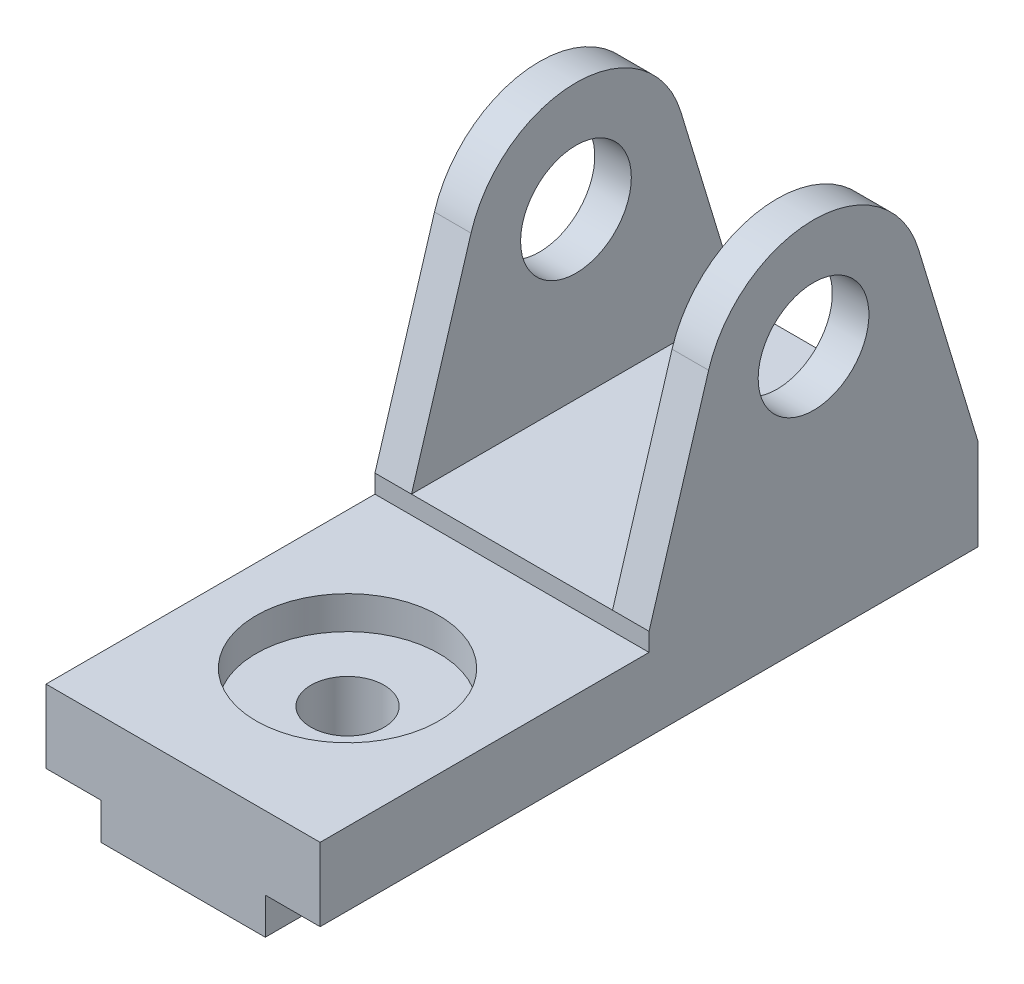
ISO-10303-21;
HEADER;
FILE_DESCRIPTION(('STEP AP214'),'2;1');
FILE_NAME('part.step','',(''),(''),'','','');
FILE_SCHEMA(('AUTOMOTIVE_DESIGN { 1 0 10303 214 1 1 1 1 }'));
ENDSEC;
DATA;
#1=APPLICATION_CONTEXT('core data for automotive mechanical design processes');
#2=APPLICATION_PROTOCOL_DEFINITION('international standard','automotive_design',2000,#1);
#3=PRODUCT_CONTEXT('',#1,'mechanical');
#4=PRODUCT('Part','Part','',(#3));
#5=PRODUCT_RELATED_PRODUCT_CATEGORY('part','',(#4));
#6=PRODUCT_DEFINITION_FORMATION('','',#4);
#7=PRODUCT_DEFINITION_CONTEXT('part definition',#1,'design');
#8=PRODUCT_DEFINITION('design','',#6,#7);
#9=PRODUCT_DEFINITION_SHAPE('','',#8);
#10=(LENGTH_UNIT() NAMED_UNIT(*) SI_UNIT(.MILLI.,.METRE.));
#11=(NAMED_UNIT(*) PLANE_ANGLE_UNIT() SI_UNIT($,.RADIAN.));
#12=(NAMED_UNIT(*) SI_UNIT($,.STERADIAN.) SOLID_ANGLE_UNIT());
#13=UNCERTAINTY_MEASURE_WITH_UNIT(LENGTH_MEASURE(1.E-05),#10,'distance_accuracy_value','');
#14=(GEOMETRIC_REPRESENTATION_CONTEXT(3) GLOBAL_UNCERTAINTY_ASSIGNED_CONTEXT((#13)) GLOBAL_UNIT_ASSIGNED_CONTEXT((#10,
#11,#12)) REPRESENTATION_CONTEXT('',''));
#15=CARTESIAN_POINT('',(0.,0.,0.));
#16=DIRECTION('',(0.,0.,1.));
#17=DIRECTION('',(1.,0.,0.));
#18=AXIS2_PLACEMENT_3D('',#15,#16,#17);
#19=CARTESIAN_POINT('',(157.915945787923,35.,0.));
#20=DIRECTION('',(0.,0.29027623112899,0.956942897795657));
#21=DIRECTION('',(0.,-0.956942897795657,0.29027623112899));
#22=AXIS2_PLACEMENT_3D('',#19,#20,#21);
#23=PLANE('',#22);
#24=DIRECTION('',(-1.,0.,0.));
#25=VECTOR('',#24,1.);
#26=CARTESIAN_POINT('',(157.915945787923,35.,0.));
#27=LINE('',#26,#25);
#28=CARTESIAN_POINT('',(-27.5,35.,0.));
#29=VERTEX_POINT('',#28);
#30=CARTESIAN_POINT('',(-37.5,35.,0.));
#31=VERTEX_POINT('',#30);
#32=EDGE_CURVE('E185',#29,#31,#27,.T.);
#33=ORIENTED_EDGE('',*,*,#32,.F.);
#34=DIRECTION('',(0.,0.956942897795657,-0.29027623112899));
#35=VECTOR('',#34,1.);
#36=CARTESIAN_POINT('',(-27.5,35.,0.));
#37=LINE('',#36,#35);
#38=CARTESIAN_POINT('',(-27.5,88.7082869338697,-16.2917130661303));
#39=VERTEX_POINT('',#38);
#40=EDGE_CURVE('E162',#29,#39,#37,.T.);
#41=ORIENTED_EDGE('',*,*,#40,.T.);
#42=DIRECTION('',(-1.,0.,0.));
#43=VECTOR('',#42,1.);
#44=CARTESIAN_POINT('',(157.915945787923,88.7082869338697,-16.2917130661303));
#45=LINE('',#44,#43);
#46=CARTESIAN_POINT('',(-37.5,88.7082869338697,-16.2917130661303));
#47=VERTEX_POINT('',#46);
#48=EDGE_CURVE('E263',#39,#47,#45,.T.);
#49=ORIENTED_EDGE('',*,*,#48,.T.);
#50=DIRECTION('',(0.,0.956942897795657,-0.29027623112899));
#51=VECTOR('',#50,1.);
#52=CARTESIAN_POINT('',(-37.5,35.,0.));
#53=LINE('',#52,#51);
#54=EDGE_CURVE('E187',#31,#47,#53,.T.);
#55=ORIENTED_EDGE('',*,*,#54,.F.);
#56=EDGE_LOOP('',(#33,#41,#49,#55));
#57=FACE_BOUND('',#56,.T.);
#58=ADVANCED_FACE('F45',(#57),#23,.T.);
#59=CARTESIAN_POINT('',(37.5,88.7082869338697,-16.2917130661303));
#60=VERTEX_POINT('',#59);
#61=CARTESIAN_POINT('',(27.5,88.7082869338697,-16.2917130661303));
#62=VERTEX_POINT('',#61);
#63=EDGE_CURVE('E260',#60,#62,#45,.T.);
#64=ORIENTED_EDGE('',*,*,#63,.T.);
#65=DIRECTION('',(0.,-0.956942897795657,0.29027623112899));
#66=VECTOR('',#65,1.);
#67=CARTESIAN_POINT('',(27.5,35.,0.));
#68=LINE('',#67,#66);
#69=CARTESIAN_POINT('',(27.5,35.,0.));
#70=VERTEX_POINT('',#69);
#71=EDGE_CURVE('E213',#62,#70,#68,.T.);
#72=ORIENTED_EDGE('',*,*,#71,.T.);
#73=CARTESIAN_POINT('',(37.5,35.,0.));
#74=VERTEX_POINT('',#73);
#75=EDGE_CURVE('E189',#74,#70,#27,.T.);
#76=ORIENTED_EDGE('',*,*,#75,.F.);
#77=DIRECTION('',(0.,-0.956942897795657,0.29027623112899));
#78=VECTOR('',#77,1.);
#79=CARTESIAN_POINT('',(37.5,35.,0.));
#80=LINE('',#79,#78);
#81=EDGE_CURVE('E227',#60,#74,#80,.T.);
#82=ORIENTED_EDGE('',*,*,#81,.F.);
#83=EDGE_LOOP('',(#64,#72,#76,#82));
#84=FACE_BOUND('',#83,.T.);
#85=ADVANCED_FACE('F371',(#84),#23,.T.);
#86=CARTESIAN_POINT('',(157.915945787923,80.,-45.));
#87=DIRECTION('',(-1.,0.,0.));
#88=DIRECTION('',(0.,0.,1.));
#89=AXIS2_PLACEMENT_3D('',#86,#87,#88);
#90=CYLINDRICAL_SURFACE('',#89,30.);
#91=CARTESIAN_POINT('',(-27.5,80.,-45.));
#92=DIRECTION('',(1.,0.,0.));
#93=DIRECTION('',(0.,0.,-1.));
#94=AXIS2_PLACEMENT_3D('',#91,#92,#93);
#95=CIRCLE('',#94,30.);
#96=CARTESIAN_POINT('',(-27.5,88.7082869338697,-73.7082869338697));
#97=VERTEX_POINT('',#96);
#98=EDGE_CURVE('E169',#39,#97,#95,.F.);
#99=ORIENTED_EDGE('',*,*,#98,.T.);
#100=DIRECTION('',(-1.,0.,0.));
#101=VECTOR('',#100,1.);
#102=CARTESIAN_POINT('',(157.915945787923,88.7082869338697,-73.7082869338697));
#103=LINE('',#102,#101);
#104=CARTESIAN_POINT('',(-37.5,88.7082869338697,-73.7082869338697));
#105=VERTEX_POINT('',#104);
#106=EDGE_CURVE('E259',#97,#105,#103,.T.);
#107=ORIENTED_EDGE('',*,*,#106,.T.);
#108=CARTESIAN_POINT('',(-37.5,80.,-45.));
#109=DIRECTION('',(-1.,0.,0.));
#110=DIRECTION('',(0.,0.,1.));
#111=AXIS2_PLACEMENT_3D('',#108,#109,#110);
#112=CIRCLE('',#111,30.);
#113=EDGE_CURVE('E243',#47,#105,#112,.T.);
#114=ORIENTED_EDGE('',*,*,#113,.F.);
#115=ORIENTED_EDGE('',*,*,#48,.F.);
#116=EDGE_LOOP('',(#99,#107,#114,#115));
#117=FACE_BOUND('',#116,.T.);
#118=ADVANCED_FACE('F377',(#117),#90,.T.);
#119=CARTESIAN_POINT('',(37.5,88.7082869338697,-73.7082869338697));
#120=VERTEX_POINT('',#119);
#121=CARTESIAN_POINT('',(27.5,88.7082869338697,-73.7082869338697));
#122=VERTEX_POINT('',#121);
#123=EDGE_CURVE('E255',#120,#122,#103,.T.);
#124=ORIENTED_EDGE('',*,*,#123,.T.);
#125=CARTESIAN_POINT('',(27.5,80.,-45.));
#126=DIRECTION('',(-1.,0.,0.));
#127=DIRECTION('',(0.,0.,1.));
#128=AXIS2_PLACEMENT_3D('',#125,#126,#127);
#129=CIRCLE('',#128,30.);
#130=EDGE_CURVE('E209',#122,#62,#129,.F.);
#131=ORIENTED_EDGE('',*,*,#130,.T.);
#132=ORIENTED_EDGE('',*,*,#63,.F.);
#133=CARTESIAN_POINT('',(37.5,80.,-45.));
#134=DIRECTION('',(-1.,0.,0.));
#135=DIRECTION('',(0.,0.,1.));
#136=AXIS2_PLACEMENT_3D('',#133,#134,#135);
#137=CIRCLE('',#136,30.);
#138=EDGE_CURVE('E230',#120,#60,#137,.F.);
#139=ORIENTED_EDGE('',*,*,#138,.F.);
#140=EDGE_LOOP('',(#124,#131,#132,#139));
#141=FACE_BOUND('',#140,.T.);
#142=ADVANCED_FACE('F494',(#141),#90,.T.);
#143=CARTESIAN_POINT('',(157.915945787923,35.,-90.));
#144=DIRECTION('',(0.,0.29027623112899,-0.956942897795657));
#145=DIRECTION('',(0.,0.956942897795657,0.29027623112899));
#146=AXIS2_PLACEMENT_3D('',#143,#144,#145);
#147=PLANE('',#146);
#148=ORIENTED_EDGE('',*,*,#106,.F.);
#149=DIRECTION('',(0.,-0.956942897795657,-0.29027623112899));
#150=VECTOR('',#149,1.);
#151=CARTESIAN_POINT('',(-27.5,35.,-90.));
#152=LINE('',#151,#150);
#153=CARTESIAN_POINT('',(-27.5,35.,-90.));
#154=VERTEX_POINT('',#153);
#155=EDGE_CURVE('E217',#97,#154,#152,.T.);
#156=ORIENTED_EDGE('',*,*,#155,.T.);
#157=DIRECTION('',(-1.,0.,0.));
#158=VECTOR('',#157,1.);
#159=CARTESIAN_POINT('',(157.915945787923,35.,-90.));
#160=LINE('',#159,#158);
#161=CARTESIAN_POINT('',(-37.5,35.,-90.));
#162=VERTEX_POINT('',#161);
#163=EDGE_CURVE('E254',#154,#162,#160,.T.);
#164=ORIENTED_EDGE('',*,*,#163,.T.);
#165=DIRECTION('',(0.,-0.956942897795657,-0.29027623112899));
#166=VECTOR('',#165,1.);
#167=CARTESIAN_POINT('',(-37.5,35.,-90.));
#168=LINE('',#167,#166);
#169=EDGE_CURVE('E247',#105,#162,#168,.T.);
#170=ORIENTED_EDGE('',*,*,#169,.F.);
#171=EDGE_LOOP('',(#148,#156,#164,#170));
#172=FACE_BOUND('',#171,.T.);
#173=ADVANCED_FACE('F500',(#172),#147,.T.);
#174=CARTESIAN_POINT('',(37.5,35.,-90.));
#175=VERTEX_POINT('',#174);
#176=CARTESIAN_POINT('',(27.5,35.,-90.));
#177=VERTEX_POINT('',#176);
#178=EDGE_CURVE('E231',#175,#177,#160,.T.);
#179=ORIENTED_EDGE('',*,*,#178,.T.);
#180=DIRECTION('',(0.,0.956942897795657,0.29027623112899));
#181=VECTOR('',#180,1.);
#182=CARTESIAN_POINT('',(27.5,35.,-90.));
#183=LINE('',#182,#181);
#184=EDGE_CURVE('E205',#177,#122,#183,.T.);
#185=ORIENTED_EDGE('',*,*,#184,.T.);
#186=ORIENTED_EDGE('',*,*,#123,.F.);
#187=DIRECTION('',(0.,0.956942897795657,0.29027623112899));
#188=VECTOR('',#187,1.);
#189=CARTESIAN_POINT('',(37.5,35.,-90.));
#190=LINE('',#189,#188);
#191=EDGE_CURVE('E226',#175,#120,#190,.T.);
#192=ORIENTED_EDGE('',*,*,#191,.F.);
#193=EDGE_LOOP('',(#179,#185,#186,#192));
#194=FACE_BOUND('',#193,.T.);
#195=ADVANCED_FACE('F366',(#194),#147,.T.);
#196=CARTESIAN_POINT('',(157.915945787923,80.,-45.));
#197=DIRECTION('',(-1.,0.,0.));
#198=DIRECTION('',(0.,0.,1.));
#199=AXIS2_PLACEMENT_3D('',#196,#197,#198);
#200=CYLINDRICAL_SURFACE('',#199,15.1496212561406);
#201=CARTESIAN_POINT('',(-37.5,80.,-45.));
#202=DIRECTION('',(-1.,0.,0.));
#203=DIRECTION('',(0.,0.,1.));
#204=AXIS2_PLACEMENT_3D('',#201,#202,#203);
#205=CIRCLE('',#204,15.1496212561406);
#206=CARTESIAN_POINT('',(-37.5,80.,-29.8503787438595));
#207=VERTEX_POINT('',#206);
#208=EDGE_CURVE('E174',#207,#207,#205,.T.);
#209=ORIENTED_EDGE('',*,*,#208,.T.);
#210=EDGE_LOOP('',(#209));
#211=FACE_BOUND('',#210,.T.);
#212=CARTESIAN_POINT('',(-27.5,80.,-45.));
#213=DIRECTION('',(1.,0.,0.));
#214=DIRECTION('',(0.,0.,-1.));
#215=AXIS2_PLACEMENT_3D('',#212,#213,#214);
#216=CIRCLE('',#215,15.1496212561406);
#217=CARTESIAN_POINT('',(-27.5,80.,-60.1496212561406));
#218=VERTEX_POINT('',#217);
#219=EDGE_CURVE('E49',#218,#218,#216,.F.);
#220=ORIENTED_EDGE('',*,*,#219,.F.);
#221=EDGE_LOOP('',(#220));
#222=FACE_BOUND('',#221,.T.);
#223=ADVANCED_FACE('F356',(#211,#222),#200,.F.);
#224=CARTESIAN_POINT('',(37.5,80.,-45.));
#225=DIRECTION('',(-1.,0.,0.));
#226=DIRECTION('',(0.,0.,1.));
#227=AXIS2_PLACEMENT_3D('',#224,#225,#226);
#228=CIRCLE('',#227,15.1496212561406);
#229=CARTESIAN_POINT('',(37.5,80.,-29.8503787438595));
#230=VERTEX_POINT('',#229);
#231=EDGE_CURVE('E225',#230,#230,#228,.F.);
#232=ORIENTED_EDGE('',*,*,#231,.T.);
#233=EDGE_LOOP('',(#232));
#234=FACE_BOUND('',#233,.T.);
#235=CARTESIAN_POINT('',(27.5,80.,-45.));
#236=DIRECTION('',(-1.,0.,0.));
#237=DIRECTION('',(0.,0.,1.));
#238=AXIS2_PLACEMENT_3D('',#235,#236,#237);
#239=CIRCLE('',#238,15.1496212561406);
#240=CARTESIAN_POINT('',(27.5,80.,-29.8503787438595));
#241=VERTEX_POINT('',#240);
#242=EDGE_CURVE('E204',#241,#241,#239,.F.);
#243=ORIENTED_EDGE('',*,*,#242,.F.);
#244=EDGE_LOOP('',(#243));
#245=FACE_BOUND('',#244,.T.);
#246=ADVANCED_FACE('F353',(#234,#245),#200,.F.);
#247=CARTESIAN_POINT('',(0.,30.,0.));
#248=DIRECTION('',(0.,1.,0.));
#249=DIRECTION('',(0.,0.,1.));
#250=AXIS2_PLACEMENT_3D('',#247,#248,#249);
#251=PLANE('',#250);
#252=CARTESIAN_POINT('',(0.,30.,45.));
#253=DIRECTION('',(0.,1.,0.));
#254=DIRECTION('',(0.,0.,1.));
#255=AXIS2_PLACEMENT_3D('',#252,#253,#254);
#256=CIRCLE('',#255,25.);
#257=CARTESIAN_POINT('',(0.,30.,70.));
#258=VERTEX_POINT('',#257);
#259=EDGE_CURVE('E470',#258,#258,#256,.T.);
#260=ORIENTED_EDGE('',*,*,#259,.F.);
#261=EDGE_LOOP('',(#260));
#262=FACE_BOUND('',#261,.T.);
#263=DIRECTION('',(0.,0.,-1.));
#264=VECTOR('',#263,1.);
#265=CARTESIAN_POINT('',(37.5,30.,-90.));
#266=LINE('',#265,#264);
#267=CARTESIAN_POINT('',(37.5,30.,90.));
#268=VERTEX_POINT('',#267);
#269=CARTESIAN_POINT('',(37.5,30.,0.));
#270=VERTEX_POINT('',#269);
#271=EDGE_CURVE('E321',#268,#270,#266,.T.);
#272=ORIENTED_EDGE('',*,*,#271,.T.);
#273=DIRECTION('',(-1.,0.,0.));
#274=VECTOR('',#273,1.);
#275=CARTESIAN_POINT('',(157.915945787923,30.,0.));
#276=LINE('',#275,#274);
#277=CARTESIAN_POINT('',(-37.5,30.,0.));
#278=VERTEX_POINT('',#277);
#279=EDGE_CURVE('E190',#270,#278,#276,.T.);
#280=ORIENTED_EDGE('',*,*,#279,.T.);
#281=DIRECTION('',(0.,0.,1.));
#282=VECTOR('',#281,1.);
#283=CARTESIAN_POINT('',(-37.5,30.,-90.));
#284=LINE('',#283,#282);
#285=CARTESIAN_POINT('',(-37.5,30.,90.));
#286=VERTEX_POINT('',#285);
#287=EDGE_CURVE('E325',#278,#286,#284,.T.);
#288=ORIENTED_EDGE('',*,*,#287,.T.);
#289=DIRECTION('',(1.,0.,0.));
#290=VECTOR('',#289,1.);
#291=CARTESIAN_POINT('',(-37.5,30.,90.));
#292=LINE('',#291,#290);
#293=EDGE_CURVE('E329',#286,#268,#292,.T.);
#294=ORIENTED_EDGE('',*,*,#293,.T.);
#295=EDGE_LOOP('',(#272,#280,#288,#294));
#296=FACE_BOUND('',#295,.T.);
#297=ADVANCED_FACE('F355',(#262,#296),#251,.T.);
#298=CARTESIAN_POINT('',(37.5,30.,-90.));
#299=DIRECTION('',(-1.,0.,0.));
#300=DIRECTION('',(0.,0.,1.));
#301=AXIS2_PLACEMENT_3D('',#298,#299,#300);
#302=PLANE('',#301);
#303=DIRECTION('',(0.,0.,1.));
#304=VECTOR('',#303,1.);
#305=CARTESIAN_POINT('',(37.5,9.99999999999999,-90.));
#306=LINE('',#305,#304);
#307=CARTESIAN_POINT('',(37.5,9.99999999999999,-90.));
#308=VERTEX_POINT('',#307);
#309=CARTESIAN_POINT('',(37.5,9.99999999999999,90.));
#310=VERTEX_POINT('',#309);
#311=EDGE_CURVE('E279',#308,#310,#306,.T.);
#312=ORIENTED_EDGE('',*,*,#311,.F.);
#313=DIRECTION('',(0.,-1.,0.));
#314=VECTOR('',#313,1.);
#315=CARTESIAN_POINT('',(37.5,30.,-90.));
#316=LINE('',#315,#314);
#317=EDGE_CURVE('E11',#175,#308,#316,.T.);
#318=ORIENTED_EDGE('',*,*,#317,.F.);
#319=ORIENTED_EDGE('',*,*,#191,.T.);
#320=ORIENTED_EDGE('',*,*,#138,.T.);
#321=ORIENTED_EDGE('',*,*,#81,.T.);
#322=DIRECTION('',(0.,-1.,0.));
#323=VECTOR('',#322,1.);
#324=CARTESIAN_POINT('',(37.5,30.,0.));
#325=LINE('',#324,#323);
#326=EDGE_CURVE('E222',#74,#270,#325,.T.);
#327=ORIENTED_EDGE('',*,*,#326,.T.);
#328=ORIENTED_EDGE('',*,*,#271,.F.);
#329=DIRECTION('',(0.,-1.,0.));
#330=VECTOR('',#329,1.);
#331=CARTESIAN_POINT('',(37.5,30.,90.));
#332=LINE('',#331,#330);
#333=EDGE_CURVE('E332',#268,#310,#332,.T.);
#334=ORIENTED_EDGE('',*,*,#333,.T.);
#335=EDGE_LOOP('',(#312,#318,#319,#320,#321,#327,#328,#334));
#336=FACE_BOUND('',#335,.T.);
#337=ORIENTED_EDGE('',*,*,#231,.F.);
#338=EDGE_LOOP('',(#337));
#339=FACE_BOUND('',#338,.T.);
#340=ADVANCED_FACE('F47',(#336,#339),#302,.F.);
#341=CARTESIAN_POINT('',(-37.5,30.,-90.));
#342=DIRECTION('',(0.,0.,1.));
#343=DIRECTION('',(1.,0.,0.));
#344=AXIS2_PLACEMENT_3D('',#341,#342,#343);
#345=PLANE('',#344);
#346=DIRECTION('',(0.,1.,0.));
#347=VECTOR('',#346,1.);
#348=CARTESIAN_POINT('',(22.5,0.,-90.));
#349=LINE('',#348,#347);
#350=CARTESIAN_POINT('',(22.5,0.,-90.));
#351=VERTEX_POINT('',#350);
#352=CARTESIAN_POINT('',(22.5,10.,-90.));
#353=VERTEX_POINT('',#352);
#354=EDGE_CURVE('E275',#351,#353,#349,.T.);
#355=ORIENTED_EDGE('',*,*,#354,.F.);
#356=DIRECTION('',(-1.,0.,0.));
#357=VECTOR('',#356,1.);
#358=CARTESIAN_POINT('',(-37.5,0.,-90.));
#359=LINE('',#358,#357);
#360=CARTESIAN_POINT('',(-22.5,0.,-90.));
#361=VERTEX_POINT('',#360);
#362=EDGE_CURVE('E315',#351,#361,#359,.T.);
#363=ORIENTED_EDGE('',*,*,#362,.T.);
#364=DIRECTION('',(0.,1.,0.));
#365=VECTOR('',#364,1.);
#366=CARTESIAN_POINT('',(-22.5,0.,-90.));
#367=LINE('',#366,#365);
#368=CARTESIAN_POINT('',(-22.5,10.,-90.));
#369=VERTEX_POINT('',#368);
#370=EDGE_CURVE('E296',#361,#369,#367,.T.);
#371=ORIENTED_EDGE('',*,*,#370,.T.);
#372=DIRECTION('',(-1.,0.,0.));
#373=VECTOR('',#372,1.);
#374=CARTESIAN_POINT('',(-22.5,10.,-90.));
#375=LINE('',#374,#373);
#376=CARTESIAN_POINT('',(-37.5,9.99999999999999,-90.));
#377=VERTEX_POINT('',#376);
#378=EDGE_CURVE('E300',#369,#377,#375,.T.);
#379=ORIENTED_EDGE('',*,*,#378,.T.);
#380=DIRECTION('',(0.,-1.,0.));
#381=VECTOR('',#380,1.);
#382=CARTESIAN_POINT('',(-37.5,30.,-90.));
#383=LINE('',#382,#381);
#384=EDGE_CURVE('E55',#162,#377,#383,.T.);
#385=ORIENTED_EDGE('',*,*,#384,.F.);
#386=ORIENTED_EDGE('',*,*,#163,.F.);
#387=DIRECTION('',(-1.,0.,0.));
#388=VECTOR('',#387,1.);
#389=CARTESIAN_POINT('',(-27.5,35.,-90.));
#390=LINE('',#389,#388);
#391=EDGE_CURVE('E180',#177,#154,#390,.T.);
#392=ORIENTED_EDGE('',*,*,#391,.F.);
#393=ORIENTED_EDGE('',*,*,#178,.F.);
#394=ORIENTED_EDGE('',*,*,#317,.T.);
#395=DIRECTION('',(1.,0.,0.));
#396=VECTOR('',#395,1.);
#397=CARTESIAN_POINT('',(22.5,10.,-90.));
#398=LINE('',#397,#396);
#399=EDGE_CURVE('E272',#353,#308,#398,.T.);
#400=ORIENTED_EDGE('',*,*,#399,.F.);
#401=EDGE_LOOP('',(#355,#363,#371,#379,#385,#386,#392,#393,#394,#400));
#402=FACE_BOUND('',#401,.T.);
#403=ADVANCED_FACE('F407',(#402),#345,.F.);
#404=CARTESIAN_POINT('',(-37.5,30.,90.));
#405=DIRECTION('',(0.,0.,-1.));
#406=DIRECTION('',(-1.,0.,0.));
#407=AXIS2_PLACEMENT_3D('',#404,#405,#406);
#408=PLANE('',#407);
#409=DIRECTION('',(0.,1.,0.));
#410=VECTOR('',#409,1.);
#411=CARTESIAN_POINT('',(22.5,0.,90.));
#412=LINE('',#411,#410);
#413=CARTESIAN_POINT('',(22.5,0.,90.));
#414=VERTEX_POINT('',#413);
#415=CARTESIAN_POINT('',(22.5,10.,90.));
#416=VERTEX_POINT('',#415);
#417=EDGE_CURVE('E276',#414,#416,#412,.T.);
#418=ORIENTED_EDGE('',*,*,#417,.T.);
#419=DIRECTION('',(1.,0.,0.));
#420=VECTOR('',#419,1.);
#421=CARTESIAN_POINT('',(22.5,10.,90.));
#422=LINE('',#421,#420);
#423=EDGE_CURVE('E271',#416,#310,#422,.T.);
#424=ORIENTED_EDGE('',*,*,#423,.T.);
#425=ORIENTED_EDGE('',*,*,#333,.F.);
#426=ORIENTED_EDGE('',*,*,#293,.F.);
#427=DIRECTION('',(0.,-1.,0.));
#428=VECTOR('',#427,1.);
#429=CARTESIAN_POINT('',(-37.5,30.,90.));
#430=LINE('',#429,#428);
#431=CARTESIAN_POINT('',(-37.5,9.99999999999999,90.));
#432=VERTEX_POINT('',#431);
#433=EDGE_CURVE('E341',#286,#432,#430,.T.);
#434=ORIENTED_EDGE('',*,*,#433,.T.);
#435=DIRECTION('',(-1.,0.,0.));
#436=VECTOR('',#435,1.);
#437=CARTESIAN_POINT('',(-22.5,10.,90.));
#438=LINE('',#437,#436);
#439=CARTESIAN_POINT('',(-22.5,10.,90.));
#440=VERTEX_POINT('',#439);
#441=EDGE_CURVE('E301',#440,#432,#438,.T.);
#442=ORIENTED_EDGE('',*,*,#441,.F.);
#443=DIRECTION('',(0.,1.,0.));
#444=VECTOR('',#443,1.);
#445=CARTESIAN_POINT('',(-22.5,0.,90.));
#446=LINE('',#445,#444);
#447=CARTESIAN_POINT('',(-22.5,0.,90.));
#448=VERTEX_POINT('',#447);
#449=EDGE_CURVE('E290',#448,#440,#446,.T.);
#450=ORIENTED_EDGE('',*,*,#449,.F.);
#451=DIRECTION('',(1.,0.,0.));
#452=VECTOR('',#451,1.);
#453=CARTESIAN_POINT('',(-37.5,0.,90.));
#454=LINE('',#453,#452);
#455=EDGE_CURVE('E326',#448,#414,#454,.T.);
#456=ORIENTED_EDGE('',*,*,#455,.T.);
#457=EDGE_LOOP('',(#418,#424,#425,#426,#434,#442,#450,#456));
#458=FACE_BOUND('',#457,.T.);
#459=ADVANCED_FACE('F403',(#458),#408,.F.);
#460=CARTESIAN_POINT('',(0.,0.,0.));
#461=DIRECTION('',(0.,1.,0.));
#462=DIRECTION('',(0.,0.,1.));
#463=AXIS2_PLACEMENT_3D('',#460,#461,#462);
#464=PLANE('',#463);
#465=CARTESIAN_POINT('',(0.,0.,45.));
#466=DIRECTION('',(0.,1.,0.));
#467=DIRECTION('',(0.,0.,1.));
#468=AXIS2_PLACEMENT_3D('',#465,#466,#467);
#469=CIRCLE('',#468,10.);
#470=CARTESIAN_POINT('',(0.,0.,55.));
#471=VERTEX_POINT('',#470);
#472=EDGE_CURVE('E182',#471,#471,#469,.T.);
#473=ORIENTED_EDGE('',*,*,#472,.T.);
#474=EDGE_LOOP('',(#473));
#475=FACE_BOUND('',#474,.T.);
#476=DIRECTION('',(0.,0.,1.));
#477=VECTOR('',#476,1.);
#478=CARTESIAN_POINT('',(22.5,0.,-90.));
#479=LINE('',#478,#477);
#480=EDGE_CURVE('E286',#351,#414,#479,.T.);
#481=ORIENTED_EDGE('',*,*,#480,.T.);
#482=ORIENTED_EDGE('',*,*,#455,.F.);
#483=DIRECTION('',(0.,0.,1.));
#484=VECTOR('',#483,1.);
#485=CARTESIAN_POINT('',(-22.5,0.,-90.));
#486=LINE('',#485,#484);
#487=EDGE_CURVE('E305',#361,#448,#486,.T.);
#488=ORIENTED_EDGE('',*,*,#487,.F.);
#489=ORIENTED_EDGE('',*,*,#362,.F.);
#490=EDGE_LOOP('',(#481,#482,#488,#489));
#491=FACE_BOUND('',#490,.T.);
#492=ADVANCED_FACE('F400',(#475,#491),#464,.F.);
#493=CARTESIAN_POINT('',(-37.5,30.,-90.));
#494=DIRECTION('',(1.,0.,0.));
#495=DIRECTION('',(0.,0.,-1.));
#496=AXIS2_PLACEMENT_3D('',#493,#494,#495);
#497=PLANE('',#496);
#498=ORIENTED_EDGE('',*,*,#384,.T.);
#499=DIRECTION('',(0.,0.,1.));
#500=VECTOR('',#499,1.);
#501=CARTESIAN_POINT('',(-37.5,9.99999999999999,-90.));
#502=LINE('',#501,#500);
#503=EDGE_CURVE('E311',#377,#432,#502,.T.);
#504=ORIENTED_EDGE('',*,*,#503,.T.);
#505=ORIENTED_EDGE('',*,*,#433,.F.);
#506=ORIENTED_EDGE('',*,*,#287,.F.);
#507=DIRECTION('',(0.,1.,0.));
#508=VECTOR('',#507,1.);
#509=CARTESIAN_POINT('',(-37.5,30.,0.));
#510=LINE('',#509,#508);
#511=EDGE_CURVE('E71',#278,#31,#510,.T.);
#512=ORIENTED_EDGE('',*,*,#511,.T.);
#513=ORIENTED_EDGE('',*,*,#54,.T.);
#514=ORIENTED_EDGE('',*,*,#113,.T.);
#515=ORIENTED_EDGE('',*,*,#169,.T.);
#516=EDGE_LOOP('',(#498,#504,#505,#506,#512,#513,#514,#515));
#517=FACE_BOUND('',#516,.T.);
#518=ORIENTED_EDGE('',*,*,#208,.F.);
#519=EDGE_LOOP('',(#518));
#520=FACE_BOUND('',#519,.T.);
#521=ADVANCED_FACE('F395',(#517,#520),#497,.F.);
#522=CARTESIAN_POINT('',(-22.5,10.,-90.));
#523=DIRECTION('',(0.,1.,0.));
#524=DIRECTION('',(-1.,0.,0.));
#525=AXIS2_PLACEMENT_3D('',#522,#523,#524);
#526=PLANE('',#525);
#527=ORIENTED_EDGE('',*,*,#441,.T.);
#528=ORIENTED_EDGE('',*,*,#503,.F.);
#529=ORIENTED_EDGE('',*,*,#378,.F.);
#530=DIRECTION('',(0.,0.,1.));
#531=VECTOR('',#530,1.);
#532=CARTESIAN_POINT('',(-22.5,10.,-90.));
#533=LINE('',#532,#531);
#534=EDGE_CURVE('E316',#369,#440,#533,.T.);
#535=ORIENTED_EDGE('',*,*,#534,.T.);
#536=EDGE_LOOP('',(#527,#528,#529,#535));
#537=FACE_BOUND('',#536,.T.);
#538=ADVANCED_FACE('F392',(#537),#526,.F.);
#539=CARTESIAN_POINT('',(-22.5,0.,-90.));
#540=DIRECTION('',(1.,0.,0.));
#541=DIRECTION('',(0.,0.,-1.));
#542=AXIS2_PLACEMENT_3D('',#539,#540,#541);
#543=PLANE('',#542);
#544=ORIENTED_EDGE('',*,*,#449,.T.);
#545=ORIENTED_EDGE('',*,*,#534,.F.);
#546=ORIENTED_EDGE('',*,*,#370,.F.);
#547=ORIENTED_EDGE('',*,*,#487,.T.);
#548=EDGE_LOOP('',(#544,#545,#546,#547));
#549=FACE_BOUND('',#548,.T.);
#550=ADVANCED_FACE('F387',(#549),#543,.F.);
#551=CARTESIAN_POINT('',(22.5,0.,-90.));
#552=DIRECTION('',(1.,0.,0.));
#553=DIRECTION('',(0.,0.,-1.));
#554=AXIS2_PLACEMENT_3D('',#551,#552,#553);
#555=PLANE('',#554);
#556=ORIENTED_EDGE('',*,*,#417,.F.);
#557=ORIENTED_EDGE('',*,*,#480,.F.);
#558=ORIENTED_EDGE('',*,*,#354,.T.);
#559=DIRECTION('',(0.,0.,1.));
#560=VECTOR('',#559,1.);
#561=CARTESIAN_POINT('',(22.5,10.,-90.));
#562=LINE('',#561,#560);
#563=EDGE_CURVE('E291',#353,#416,#562,.T.);
#564=ORIENTED_EDGE('',*,*,#563,.T.);
#565=EDGE_LOOP('',(#556,#557,#558,#564));
#566=FACE_BOUND('',#565,.T.);
#567=ADVANCED_FACE('F384',(#566),#555,.T.);
#568=CARTESIAN_POINT('',(22.5,10.,-90.));
#569=DIRECTION('',(0.,-1.,0.));
#570=DIRECTION('',(1.,0.,0.));
#571=AXIS2_PLACEMENT_3D('',#568,#569,#570);
#572=PLANE('',#571);
#573=ORIENTED_EDGE('',*,*,#423,.F.);
#574=ORIENTED_EDGE('',*,*,#563,.F.);
#575=ORIENTED_EDGE('',*,*,#399,.T.);
#576=ORIENTED_EDGE('',*,*,#311,.T.);
#577=EDGE_LOOP('',(#573,#574,#575,#576));
#578=FACE_BOUND('',#577,.T.);
#579=ADVANCED_FACE('F383',(#578),#572,.T.);
#580=CARTESIAN_POINT('',(157.915945787923,30.,0.));
#581=DIRECTION('',(0.,0.,1.));
#582=DIRECTION('',(0.,-1.,0.));
#583=AXIS2_PLACEMENT_3D('',#580,#581,#582);
#584=PLANE('',#583);
#585=ORIENTED_EDGE('',*,*,#326,.F.);
#586=ORIENTED_EDGE('',*,*,#75,.T.);
#587=DIRECTION('',(1.,0.,0.));
#588=VECTOR('',#587,1.);
#589=CARTESIAN_POINT('',(-27.5,35.,0.));
#590=LINE('',#589,#588);
#591=EDGE_CURVE('E178',#29,#70,#590,.T.);
#592=ORIENTED_EDGE('',*,*,#591,.F.);
#593=ORIENTED_EDGE('',*,*,#32,.T.);
#594=ORIENTED_EDGE('',*,*,#511,.F.);
#595=ORIENTED_EDGE('',*,*,#279,.F.);
#596=EDGE_LOOP('',(#585,#586,#592,#593,#594,#595));
#597=FACE_BOUND('',#596,.T.);
#598=ADVANCED_FACE('F194',(#597),#584,.T.);
#599=CARTESIAN_POINT('',(-27.5,110.,0.));
#600=DIRECTION('',(1.,0.,0.));
#601=DIRECTION('',(0.,0.,-1.));
#602=AXIS2_PLACEMENT_3D('',#599,#600,#601);
#603=PLANE('',#602);
#604=DIRECTION('',(0.,0.,1.));
#605=VECTOR('',#604,1.);
#606=CARTESIAN_POINT('',(-27.5,35.,0.));
#607=LINE('',#606,#605);
#608=EDGE_CURVE('E167',#154,#29,#607,.T.);
#609=ORIENTED_EDGE('',*,*,#608,.F.);
#610=ORIENTED_EDGE('',*,*,#155,.F.);
#611=ORIENTED_EDGE('',*,*,#98,.F.);
#612=ORIENTED_EDGE('',*,*,#40,.F.);
#613=EDGE_LOOP('',(#609,#610,#611,#612));
#614=FACE_BOUND('',#613,.T.);
#615=ORIENTED_EDGE('',*,*,#219,.T.);
#616=EDGE_LOOP('',(#615));
#617=FACE_BOUND('',#616,.T.);
#618=ADVANCED_FACE('F164',(#614,#617),#603,.T.);
#619=CARTESIAN_POINT('',(27.5,110.,0.));
#620=DIRECTION('',(-1.,0.,0.));
#621=DIRECTION('',(0.,0.,1.));
#622=AXIS2_PLACEMENT_3D('',#619,#620,#621);
#623=PLANE('',#622);
#624=ORIENTED_EDGE('',*,*,#130,.F.);
#625=ORIENTED_EDGE('',*,*,#184,.F.);
#626=DIRECTION('',(0.,0.,-1.));
#627=VECTOR('',#626,1.);
#628=CARTESIAN_POINT('',(27.5,35.,0.));
#629=LINE('',#628,#627);
#630=EDGE_CURVE('E63',#70,#177,#629,.T.);
#631=ORIENTED_EDGE('',*,*,#630,.F.);
#632=ORIENTED_EDGE('',*,*,#71,.F.);
#633=EDGE_LOOP('',(#624,#625,#631,#632));
#634=FACE_BOUND('',#633,.T.);
#635=ORIENTED_EDGE('',*,*,#242,.T.);
#636=EDGE_LOOP('',(#635));
#637=FACE_BOUND('',#636,.T.);
#638=ADVANCED_FACE('F351',(#634,#637),#623,.T.);
#639=CARTESIAN_POINT('',(0.,35.,0.));
#640=DIRECTION('',(0.,-1.,0.));
#641=DIRECTION('',(0.,0.,-1.));
#642=AXIS2_PLACEMENT_3D('',#639,#640,#641);
#643=PLANE('',#642);
#644=ORIENTED_EDGE('',*,*,#608,.T.);
#645=ORIENTED_EDGE('',*,*,#591,.T.);
#646=ORIENTED_EDGE('',*,*,#630,.T.);
#647=ORIENTED_EDGE('',*,*,#391,.T.);
#648=EDGE_LOOP('',(#644,#645,#646,#647));
#649=FACE_BOUND('',#648,.T.);
#650=ADVANCED_FACE('F176',(#649),#643,.F.);
#651=CARTESIAN_POINT('',(0.,30.,45.));
#652=DIRECTION('',(0.,1.,0.));
#653=DIRECTION('',(0.,0.,1.));
#654=AXIS2_PLACEMENT_3D('',#651,#652,#653);
#655=CYLINDRICAL_SURFACE('',#654,10.);
#656=ORIENTED_EDGE('',*,*,#472,.F.);
#657=EDGE_LOOP('',(#656));
#658=FACE_BOUND('',#657,.T.);
#659=CARTESIAN_POINT('',(0.,21.,45.));
#660=DIRECTION('',(0.,1.,0.));
#661=DIRECTION('',(0.,0.,1.));
#662=AXIS2_PLACEMENT_3D('',#659,#660,#661);
#663=CIRCLE('',#662,10.);
#664=CARTESIAN_POINT('',(0.,21.,55.));
#665=VERTEX_POINT('',#664);
#666=EDGE_CURVE('E474',#665,#665,#663,.T.);
#667=ORIENTED_EDGE('',*,*,#666,.T.);
#668=EDGE_LOOP('',(#667));
#669=FACE_BOUND('',#668,.T.);
#670=ADVANCED_FACE('F451',(#658,#669),#655,.F.);
#671=CARTESIAN_POINT('',(10.,21.,45.));
#672=DIRECTION('',(0.,-1.,0.));
#673=DIRECTION('',(0.,0.,-1.));
#674=AXIS2_PLACEMENT_3D('',#671,#672,#673);
#675=PLANE('',#674);
#676=ORIENTED_EDGE('',*,*,#666,.F.);
#677=EDGE_LOOP('',(#676));
#678=FACE_BOUND('',#677,.T.);
#679=CARTESIAN_POINT('',(0.,21.,45.));
#680=DIRECTION('',(0.,1.,0.));
#681=DIRECTION('',(0.,0.,1.));
#682=AXIS2_PLACEMENT_3D('',#679,#680,#681);
#683=CIRCLE('',#682,25.);
#684=CARTESIAN_POINT('',(0.,21.,70.));
#685=VERTEX_POINT('',#684);
#686=EDGE_CURVE('E467',#685,#685,#683,.T.);
#687=ORIENTED_EDGE('',*,*,#686,.T.);
#688=EDGE_LOOP('',(#687));
#689=FACE_BOUND('',#688,.T.);
#690=ADVANCED_FACE('F454',(#678,#689),#675,.F.);
#691=CARTESIAN_POINT('',(0.,30.,45.));
#692=DIRECTION('',(0.,1.,0.));
#693=DIRECTION('',(0.,0.,1.));
#694=AXIS2_PLACEMENT_3D('',#691,#692,#693);
#695=CYLINDRICAL_SURFACE('',#694,25.);
#696=ORIENTED_EDGE('',*,*,#686,.F.);
#697=EDGE_LOOP('',(#696));
#698=FACE_BOUND('',#697,.T.);
#699=ORIENTED_EDGE('',*,*,#259,.T.);
#700=EDGE_LOOP('',(#699));
#701=FACE_BOUND('',#700,.T.);
#702=ADVANCED_FACE('F458',(#698,#701),#695,.F.);
#703=CLOSED_SHELL('',(#58,#85,#118,#142,#173,#195,#223,#246,#297,#340,#403,#459,#492,#521,#538,
#550,#567,#579,#598,#618,#638,#650,#670,#690,#702));
#704=MANIFOLD_SOLID_BREP('B2',#703);
#705=ADVANCED_BREP_SHAPE_REPRESENTATION('',(#18,#704),#14);
#706=SHAPE_DEFINITION_REPRESENTATION(#9,#705);
ENDSEC;
END-ISO-10303-21;
